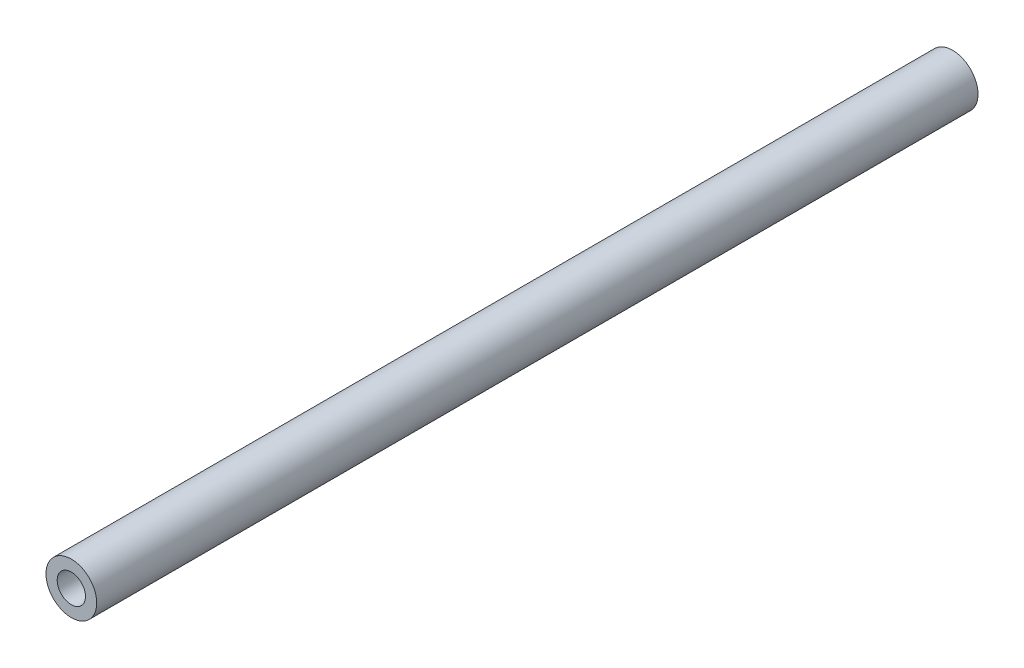
ISO-10303-21;
HEADER;
FILE_DESCRIPTION(('STEP AP214'),'2;1');
FILE_NAME('part.step','',(''),(''),'','','');
FILE_SCHEMA(('AUTOMOTIVE_DESIGN { 1 0 10303 214 1 1 1 1 }'));
ENDSEC;
DATA;
#1=APPLICATION_CONTEXT('core data for automotive mechanical design processes');
#2=APPLICATION_PROTOCOL_DEFINITION('international standard','automotive_design',2000,#1);
#3=PRODUCT_CONTEXT('',#1,'mechanical');
#4=PRODUCT('Part','Part','',(#3));
#5=PRODUCT_RELATED_PRODUCT_CATEGORY('part','',(#4));
#6=PRODUCT_DEFINITION_FORMATION('','',#4);
#7=PRODUCT_DEFINITION_CONTEXT('part definition',#1,'design');
#8=PRODUCT_DEFINITION('design','',#6,#7);
#9=PRODUCT_DEFINITION_SHAPE('','',#8);
#10=(LENGTH_UNIT() NAMED_UNIT(*) SI_UNIT(.MILLI.,.METRE.));
#11=(NAMED_UNIT(*) PLANE_ANGLE_UNIT() SI_UNIT($,.RADIAN.));
#12=(NAMED_UNIT(*) SI_UNIT($,.STERADIAN.) SOLID_ANGLE_UNIT());
#13=UNCERTAINTY_MEASURE_WITH_UNIT(LENGTH_MEASURE(1.E-05),#10,'distance_accuracy_value','');
#14=(GEOMETRIC_REPRESENTATION_CONTEXT(3) GLOBAL_UNCERTAINTY_ASSIGNED_CONTEXT((#13)) GLOBAL_UNIT_ASSIGNED_CONTEXT((#10,
#11,#12)) REPRESENTATION_CONTEXT('',''));
#15=CARTESIAN_POINT('',(0.,0.,0.));
#16=DIRECTION('',(0.,0.,1.));
#17=DIRECTION('',(1.,0.,0.));
#18=AXIS2_PLACEMENT_3D('',#15,#16,#17);
#19=CARTESIAN_POINT('',(0.,0.,296.85));
#20=DIRECTION('',(0.,0.,1.));
#21=DIRECTION('',(1.,0.,0.));
#22=AXIS2_PLACEMENT_3D('',#19,#20,#21);
#23=PLANE('',#22);
#24=CARTESIAN_POINT('',(0.,0.,296.85));
#25=DIRECTION('',(0.,0.,1.));
#26=DIRECTION('',(1.,0.,0.));
#27=AXIS2_PLACEMENT_3D('',#24,#25,#26);
#28=CIRCLE('',#27,8.55);
#29=CARTESIAN_POINT('',(8.55,0.,296.85));
#30=VERTEX_POINT('',#29);
#31=EDGE_CURVE('E10',#30,#30,#28,.T.);
#32=ORIENTED_EDGE('',*,*,#31,.T.);
#33=EDGE_LOOP('',(#32));
#34=FACE_BOUND('',#33,.T.);
#35=CARTESIAN_POINT('',(0.,0.,296.85));
#36=DIRECTION('',(0.,0.,1.));
#37=DIRECTION('',(1.,0.,0.));
#38=AXIS2_PLACEMENT_3D('',#35,#36,#37);
#39=CIRCLE('',#38,4.765);
#40=CARTESIAN_POINT('',(4.765,0.,296.85));
#41=VERTEX_POINT('',#40);
#42=EDGE_CURVE('E42',#41,#41,#39,.T.);
#43=ORIENTED_EDGE('',*,*,#42,.F.);
#44=EDGE_LOOP('',(#43));
#45=FACE_BOUND('',#44,.T.);
#46=ADVANCED_FACE('F31',(#34,#45),#23,.T.);
#47=CARTESIAN_POINT('',(0.,0.,0.));
#48=DIRECTION('',(0.,0.,1.));
#49=DIRECTION('',(1.,0.,0.));
#50=AXIS2_PLACEMENT_3D('',#47,#48,#49);
#51=PLANE('',#50);
#52=CARTESIAN_POINT('',(0.,0.,0.));
#53=DIRECTION('',(0.,0.,1.));
#54=DIRECTION('',(1.,0.,0.));
#55=AXIS2_PLACEMENT_3D('',#52,#53,#54);
#56=CIRCLE('',#55,8.55);
#57=CARTESIAN_POINT('',(8.55,0.,0.));
#58=VERTEX_POINT('',#57);
#59=EDGE_CURVE('E35',#58,#58,#56,.T.);
#60=ORIENTED_EDGE('',*,*,#59,.F.);
#61=EDGE_LOOP('',(#60));
#62=FACE_BOUND('',#61,.T.);
#63=CARTESIAN_POINT('',(0.,0.,0.));
#64=DIRECTION('',(0.,0.,1.));
#65=DIRECTION('',(1.,0.,0.));
#66=AXIS2_PLACEMENT_3D('',#63,#64,#65);
#67=CIRCLE('',#66,4.765);
#68=CARTESIAN_POINT('',(4.765,0.,0.));
#69=VERTEX_POINT('',#68);
#70=EDGE_CURVE('E44',#69,#69,#67,.T.);
#71=ORIENTED_EDGE('',*,*,#70,.T.);
#72=EDGE_LOOP('',(#71));
#73=FACE_BOUND('',#72,.T.);
#74=ADVANCED_FACE('F54',(#62,#73),#51,.F.);
#75=CARTESIAN_POINT('',(0.,0.,296.85));
#76=DIRECTION('',(0.,0.,-1.));
#77=DIRECTION('',(-1.,0.,0.));
#78=AXIS2_PLACEMENT_3D('',#75,#76,#77);
#79=CYLINDRICAL_SURFACE('',#78,8.55);
#80=ORIENTED_EDGE('',*,*,#31,.F.);
#81=EDGE_LOOP('',(#80));
#82=FACE_BOUND('',#81,.T.);
#83=ORIENTED_EDGE('',*,*,#59,.T.);
#84=EDGE_LOOP('',(#83));
#85=FACE_BOUND('',#84,.T.);
#86=ADVANCED_FACE('F33',(#82,#85),#79,.T.);
#87=CARTESIAN_POINT('',(0.,0.,296.85));
#88=DIRECTION('',(0.,0.,-1.));
#89=DIRECTION('',(-1.,0.,0.));
#90=AXIS2_PLACEMENT_3D('',#87,#88,#89);
#91=CYLINDRICAL_SURFACE('',#90,4.765);
#92=ORIENTED_EDGE('',*,*,#42,.T.);
#93=EDGE_LOOP('',(#92));
#94=FACE_BOUND('',#93,.T.);
#95=ORIENTED_EDGE('',*,*,#70,.F.);
#96=EDGE_LOOP('',(#95));
#97=FACE_BOUND('',#96,.T.);
#98=ADVANCED_FACE('F50',(#94,#97),#91,.F.);
#99=CLOSED_SHELL('',(#46,#74,#86,#98));
#100=MANIFOLD_SOLID_BREP('B2',#99);
#101=ADVANCED_BREP_SHAPE_REPRESENTATION('',(#18,#100),#14);
#102=SHAPE_DEFINITION_REPRESENTATION(#9,#101);
ENDSEC;
END-ISO-10303-21;
